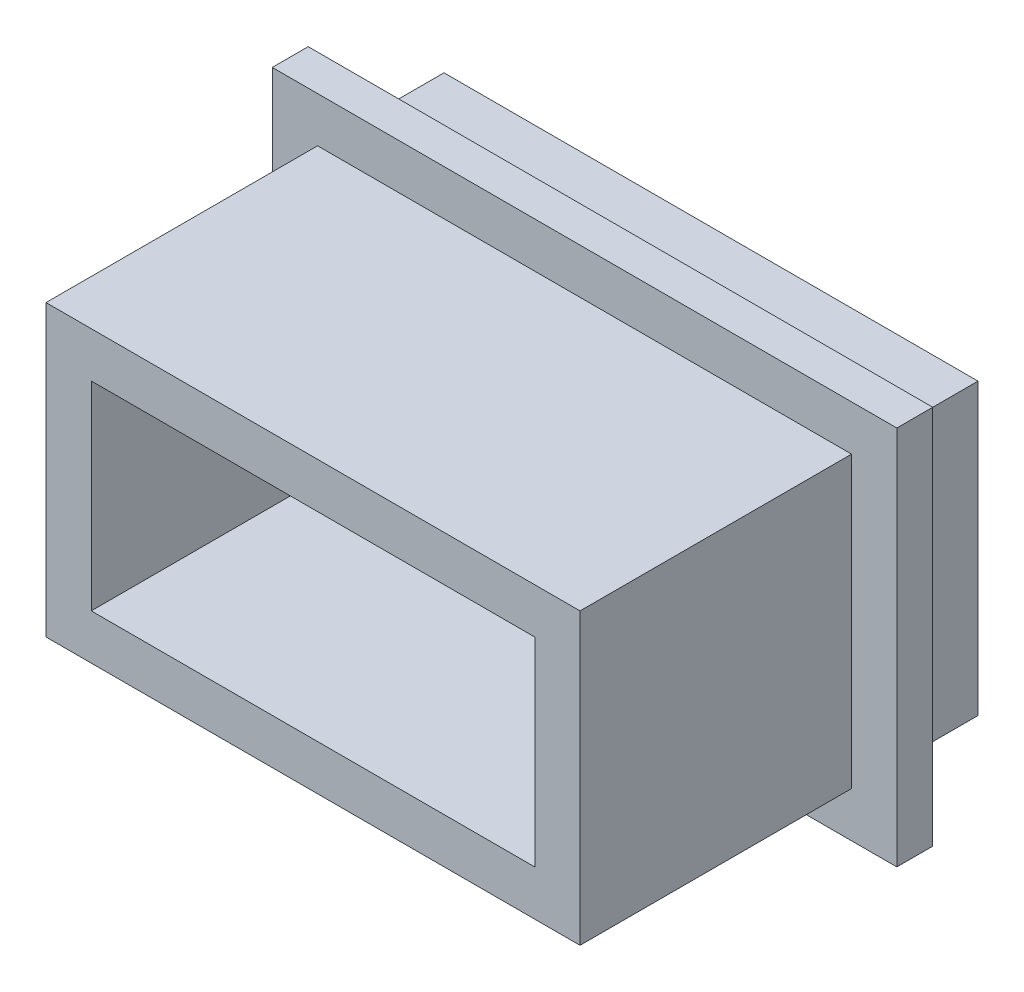
ISO-10303-21;
HEADER;
FILE_DESCRIPTION(('STEP AP214'),'2;1');
FILE_NAME('part.step','',(''),(''),'','','');
FILE_SCHEMA(('AUTOMOTIVE_DESIGN { 1 0 10303 214 1 1 1 1 }'));
ENDSEC;
DATA;
#1=APPLICATION_CONTEXT('core data for automotive mechanical design processes');
#2=APPLICATION_PROTOCOL_DEFINITION('international standard','automotive_design',2000,#1);
#3=PRODUCT_CONTEXT('',#1,'mechanical');
#4=PRODUCT('Part','Part','',(#3));
#5=PRODUCT_RELATED_PRODUCT_CATEGORY('part','',(#4));
#6=PRODUCT_DEFINITION_FORMATION('','',#4);
#7=PRODUCT_DEFINITION_CONTEXT('part definition',#1,'design');
#8=PRODUCT_DEFINITION('design','',#6,#7);
#9=PRODUCT_DEFINITION_SHAPE('','',#8);
#10=(LENGTH_UNIT() NAMED_UNIT(*) SI_UNIT(.MILLI.,.METRE.));
#11=(NAMED_UNIT(*) PLANE_ANGLE_UNIT() SI_UNIT($,.RADIAN.));
#12=(NAMED_UNIT(*) SI_UNIT($,.STERADIAN.) SOLID_ANGLE_UNIT());
#13=UNCERTAINTY_MEASURE_WITH_UNIT(LENGTH_MEASURE(1.E-05),#10,'distance_accuracy_value','');
#14=(GEOMETRIC_REPRESENTATION_CONTEXT(3) GLOBAL_UNCERTAINTY_ASSIGNED_CONTEXT((#13)) GLOBAL_UNIT_ASSIGNED_CONTEXT((#10,
#11,#12)) REPRESENTATION_CONTEXT('',''));
#15=CARTESIAN_POINT('',(0.,0.,0.));
#16=DIRECTION('',(0.,0.,1.));
#17=DIRECTION('',(1.,0.,0.));
#18=AXIS2_PLACEMENT_3D('',#15,#16,#17);
#19=CARTESIAN_POINT('',(0.,0.,1.396875));
#20=DIRECTION('',(0.,0.,1.));
#21=DIRECTION('',(1.,0.,0.));
#22=AXIS2_PLACEMENT_3D('',#19,#20,#21);
#23=PLANE('',#22);
#24=DIRECTION('',(1.,0.,0.));
#25=VECTOR('',#24,1.);
#26=CARTESIAN_POINT('',(-3.45,3.3,1.396875));
#27=LINE('',#26,#25);
#28=CARTESIAN_POINT('',(-3.45,3.3,1.396875));
#29=VERTEX_POINT('',#28);
#30=CARTESIAN_POINT('',(3.45,3.3,1.396875));
#31=VERTEX_POINT('',#30);
#32=EDGE_CURVE('E246',#29,#31,#27,.T.);
#33=ORIENTED_EDGE('',*,*,#32,.T.);
#34=DIRECTION('',(0.,1.,0.));
#35=VECTOR('',#34,1.);
#36=CARTESIAN_POINT('',(3.45,3.3,1.396875));
#37=LINE('',#36,#35);
#38=CARTESIAN_POINT('',(3.45,7.5,1.396875));
#39=VERTEX_POINT('',#38);
#40=EDGE_CURVE('E265',#31,#39,#37,.T.);
#41=ORIENTED_EDGE('',*,*,#40,.T.);
#42=DIRECTION('',(-1.,0.,0.));
#43=VECTOR('',#42,1.);
#44=CARTESIAN_POINT('',(3.45,7.5,1.396875));
#45=LINE('',#44,#43);
#46=CARTESIAN_POINT('',(-3.45,7.5,1.396875));
#47=VERTEX_POINT('',#46);
#48=EDGE_CURVE('E257',#39,#47,#45,.T.);
#49=ORIENTED_EDGE('',*,*,#48,.T.);
#50=DIRECTION('',(0.,-1.,0.));
#51=VECTOR('',#50,1.);
#52=CARTESIAN_POINT('',(-3.45,7.5,1.396875));
#53=LINE('',#52,#51);
#54=EDGE_CURVE('E249',#47,#29,#53,.T.);
#55=ORIENTED_EDGE('',*,*,#54,.T.);
#56=EDGE_LOOP('',(#33,#41,#49,#55));
#57=FACE_BOUND('',#56,.T.);
#58=DIRECTION('',(0.,1.,0.));
#59=VECTOR('',#58,1.);
#60=CARTESIAN_POINT('',(2.95,3.8,1.396875));
#61=LINE('',#60,#59);
#62=CARTESIAN_POINT('',(2.95,3.8,1.396875));
#63=VERTEX_POINT('',#62);
#64=CARTESIAN_POINT('',(2.95,7.,1.396875));
#65=VERTEX_POINT('',#64);
#66=EDGE_CURVE('E278',#63,#65,#61,.T.);
#67=ORIENTED_EDGE('',*,*,#66,.F.);
#68=DIRECTION('',(1.,0.,0.));
#69=VECTOR('',#68,1.);
#70=CARTESIAN_POINT('',(-2.95,3.8,1.396875));
#71=LINE('',#70,#69);
#72=CARTESIAN_POINT('',(-2.95,3.8,1.396875));
#73=VERTEX_POINT('',#72);
#74=EDGE_CURVE('E285',#73,#63,#71,.T.);
#75=ORIENTED_EDGE('',*,*,#74,.F.);
#76=DIRECTION('',(0.,-1.,0.));
#77=VECTOR('',#76,1.);
#78=CARTESIAN_POINT('',(-2.95,7.,1.396875));
#79=LINE('',#78,#77);
#80=CARTESIAN_POINT('',(-2.95,7.,1.396875));
#81=VERTEX_POINT('',#80);
#82=EDGE_CURVE('E274',#81,#73,#79,.T.);
#83=ORIENTED_EDGE('',*,*,#82,.F.);
#84=DIRECTION('',(-1.,0.,0.));
#85=VECTOR('',#84,1.);
#86=CARTESIAN_POINT('',(2.95,7.,1.396875));
#87=LINE('',#86,#85);
#88=EDGE_CURVE('E279',#65,#81,#87,.T.);
#89=ORIENTED_EDGE('',*,*,#88,.F.);
#90=EDGE_LOOP('',(#67,#75,#83,#89));
#91=FACE_BOUND('',#90,.T.);
#92=ADVANCED_FACE('F39',(#57,#91),#23,.T.);
#93=CARTESIAN_POINT('',(0.,0.,0.));
#94=DIRECTION('',(0.,0.,1.));
#95=DIRECTION('',(1.,0.,0.));
#96=AXIS2_PLACEMENT_3D('',#93,#94,#95);
#97=PLANE('',#96);
#98=DIRECTION('',(1.,0.,0.));
#99=VECTOR('',#98,1.);
#100=CARTESIAN_POINT('',(-2.95,3.8,0.));
#101=LINE('',#100,#99);
#102=CARTESIAN_POINT('',(-2.95,3.8,0.));
#103=VERTEX_POINT('',#102);
#104=CARTESIAN_POINT('',(2.95,3.8,0.));
#105=VERTEX_POINT('',#104);
#106=EDGE_CURVE('E140',#103,#105,#101,.T.);
#107=ORIENTED_EDGE('',*,*,#106,.F.);
#108=DIRECTION('',(0.,-1.,0.));
#109=VECTOR('',#108,1.);
#110=CARTESIAN_POINT('',(-2.95,7.,0.));
#111=LINE('',#110,#109);
#112=CARTESIAN_POINT('',(-2.95,7.,0.));
#113=VERTEX_POINT('',#112);
#114=EDGE_CURVE('E110',#113,#103,#111,.T.);
#115=ORIENTED_EDGE('',*,*,#114,.F.);
#116=DIRECTION('',(-1.,0.,0.));
#117=VECTOR('',#116,1.);
#118=CARTESIAN_POINT('',(2.95,7.,0.));
#119=LINE('',#118,#117);
#120=CARTESIAN_POINT('',(2.95,7.,0.));
#121=VERTEX_POINT('',#120);
#122=EDGE_CURVE('E131',#121,#113,#119,.T.);
#123=ORIENTED_EDGE('',*,*,#122,.F.);
#124=DIRECTION('',(0.,1.,0.));
#125=VECTOR('',#124,1.);
#126=CARTESIAN_POINT('',(2.95,3.8,0.));
#127=LINE('',#126,#125);
#128=EDGE_CURVE('E128',#105,#121,#127,.T.);
#129=ORIENTED_EDGE('',*,*,#128,.F.);
#130=EDGE_LOOP('',(#107,#115,#123,#129));
#131=FACE_BOUND('',#130,.T.);
#132=DIRECTION('',(1.,0.,0.));
#133=VECTOR('',#132,1.);
#134=CARTESIAN_POINT('',(-2.45,4.3,0.));
#135=LINE('',#134,#133);
#136=CARTESIAN_POINT('',(-2.45,4.3,0.));
#137=VERTEX_POINT('',#136);
#138=CARTESIAN_POINT('',(2.45,4.3,0.));
#139=VERTEX_POINT('',#138);
#140=EDGE_CURVE('E98',#137,#139,#135,.T.);
#141=ORIENTED_EDGE('',*,*,#140,.T.);
#142=DIRECTION('',(0.,1.,0.));
#143=VECTOR('',#142,1.);
#144=CARTESIAN_POINT('',(2.45,4.3,0.));
#145=LINE('',#144,#143);
#146=CARTESIAN_POINT('',(2.45,6.5,0.));
#147=VERTEX_POINT('',#146);
#148=EDGE_CURVE('E109',#139,#147,#145,.T.);
#149=ORIENTED_EDGE('',*,*,#148,.T.);
#150=DIRECTION('',(-1.,0.,0.));
#151=VECTOR('',#150,1.);
#152=CARTESIAN_POINT('',(2.45,6.5,0.));
#153=LINE('',#152,#151);
#154=CARTESIAN_POINT('',(-2.45,6.5,0.));
#155=VERTEX_POINT('',#154);
#156=EDGE_CURVE('E117',#147,#155,#153,.T.);
#157=ORIENTED_EDGE('',*,*,#156,.T.);
#158=DIRECTION('',(0.,-1.,0.));
#159=VECTOR('',#158,1.);
#160=CARTESIAN_POINT('',(-2.45,6.5,0.));
#161=LINE('',#160,#159);
#162=EDGE_CURVE('E118',#155,#137,#161,.T.);
#163=ORIENTED_EDGE('',*,*,#162,.T.);
#164=EDGE_LOOP('',(#141,#149,#157,#163));
#165=FACE_BOUND('',#164,.T.);
#166=ADVANCED_FACE('F119',(#131,#165),#97,.F.);
#167=CARTESIAN_POINT('',(-2.95,3.8,7.71192967781993));
#168=DIRECTION('',(0.,1.,0.));
#169=DIRECTION('',(0.,0.,1.));
#170=AXIS2_PLACEMENT_3D('',#167,#168,#169);
#171=PLANE('',#170);
#172=DIRECTION('',(0.,0.,-1.));
#173=VECTOR('',#172,1.);
#174=CARTESIAN_POINT('',(2.95,3.8,7.71192967781993));
#175=LINE('',#174,#173);
#176=CARTESIAN_POINT('',(2.95,3.8,1.));
#177=VERTEX_POINT('',#176);
#178=EDGE_CURVE('E126',#177,#105,#175,.T.);
#179=ORIENTED_EDGE('',*,*,#178,.F.);
#180=DIRECTION('',(-1.,0.,0.));
#181=VECTOR('',#180,1.);
#182=CARTESIAN_POINT('',(-2.95,3.8,1.));
#183=LINE('',#182,#181);
#184=CARTESIAN_POINT('',(-2.95,3.8,1.));
#185=VERTEX_POINT('',#184);
#186=EDGE_CURVE('E136',#177,#185,#183,.T.);
#187=ORIENTED_EDGE('',*,*,#186,.T.);
#188=DIRECTION('',(0.,0.,-1.));
#189=VECTOR('',#188,1.);
#190=CARTESIAN_POINT('',(-2.95,3.8,7.71192967781993));
#191=LINE('',#190,#189);
#192=EDGE_CURVE('E137',#185,#103,#191,.T.);
#193=ORIENTED_EDGE('',*,*,#192,.T.);
#194=ORIENTED_EDGE('',*,*,#106,.T.);
#195=EDGE_LOOP('',(#179,#187,#193,#194));
#196=FACE_BOUND('',#195,.T.);
#197=ADVANCED_FACE('F325',(#196),#171,.F.);
#198=CARTESIAN_POINT('',(2.95,3.8,7.71192967781993));
#199=DIRECTION('',(-1.,0.,0.));
#200=DIRECTION('',(0.,-1.,0.));
#201=AXIS2_PLACEMENT_3D('',#198,#199,#200);
#202=PLANE('',#201);
#203=DIRECTION('',(0.,0.,-1.));
#204=VECTOR('',#203,1.);
#205=CARTESIAN_POINT('',(2.95,7.,7.71192967781993));
#206=LINE('',#205,#204);
#207=CARTESIAN_POINT('',(2.95,7.,1.));
#208=VERTEX_POINT('',#207);
#209=EDGE_CURVE('E135',#208,#121,#206,.T.);
#210=ORIENTED_EDGE('',*,*,#209,.F.);
#211=DIRECTION('',(0.,-1.,0.));
#212=VECTOR('',#211,1.);
#213=CARTESIAN_POINT('',(2.95,3.8,1.));
#214=LINE('',#213,#212);
#215=EDGE_CURVE('E132',#208,#177,#214,.T.);
#216=ORIENTED_EDGE('',*,*,#215,.T.);
#217=ORIENTED_EDGE('',*,*,#178,.T.);
#218=ORIENTED_EDGE('',*,*,#128,.T.);
#219=EDGE_LOOP('',(#210,#216,#217,#218));
#220=FACE_BOUND('',#219,.T.);
#221=ADVANCED_FACE('F226',(#220),#202,.F.);
#222=CARTESIAN_POINT('',(2.95,7.,7.71192967781993));
#223=DIRECTION('',(0.,-1.,0.));
#224=DIRECTION('',(0.,0.,-1.));
#225=AXIS2_PLACEMENT_3D('',#222,#223,#224);
#226=PLANE('',#225);
#227=DIRECTION('',(0.,0.,-1.));
#228=VECTOR('',#227,1.);
#229=CARTESIAN_POINT('',(-2.95,7.,7.71192967781993));
#230=LINE('',#229,#228);
#231=CARTESIAN_POINT('',(-2.95,7.,1.));
#232=VERTEX_POINT('',#231);
#233=EDGE_CURVE('E138',#232,#113,#230,.T.);
#234=ORIENTED_EDGE('',*,*,#233,.F.);
#235=DIRECTION('',(1.,0.,0.));
#236=VECTOR('',#235,1.);
#237=CARTESIAN_POINT('',(2.95,7.,1.));
#238=LINE('',#237,#236);
#239=EDGE_CURVE('E133',#232,#208,#238,.T.);
#240=ORIENTED_EDGE('',*,*,#239,.T.);
#241=ORIENTED_EDGE('',*,*,#209,.T.);
#242=ORIENTED_EDGE('',*,*,#122,.T.);
#243=EDGE_LOOP('',(#234,#240,#241,#242));
#244=FACE_BOUND('',#243,.T.);
#245=ADVANCED_FACE('F233',(#244),#226,.F.);
#246=CARTESIAN_POINT('',(-2.95,7.,7.71192967781993));
#247=DIRECTION('',(1.,0.,0.));
#248=DIRECTION('',(0.,1.,0.));
#249=AXIS2_PLACEMENT_3D('',#246,#247,#248);
#250=PLANE('',#249);
#251=ORIENTED_EDGE('',*,*,#192,.F.);
#252=DIRECTION('',(0.,1.,0.));
#253=VECTOR('',#252,1.);
#254=CARTESIAN_POINT('',(-2.95,7.,1.));
#255=LINE('',#254,#253);
#256=EDGE_CURVE('E43',#185,#232,#255,.T.);
#257=ORIENTED_EDGE('',*,*,#256,.T.);
#258=ORIENTED_EDGE('',*,*,#233,.T.);
#259=ORIENTED_EDGE('',*,*,#114,.T.);
#260=EDGE_LOOP('',(#251,#257,#258,#259));
#261=FACE_BOUND('',#260,.T.);
#262=ADVANCED_FACE('F338',(#261),#250,.F.);
#263=CARTESIAN_POINT('',(-2.45,4.3,7.71192967781993));
#264=DIRECTION('',(0.,1.,0.));
#265=DIRECTION('',(0.,0.,1.));
#266=AXIS2_PLACEMENT_3D('',#263,#264,#265);
#267=PLANE('',#266);
#268=DIRECTION('',(0.,0.,-1.));
#269=VECTOR('',#268,1.);
#270=CARTESIAN_POINT('',(-2.45,4.3,7.71192967781993));
#271=LINE('',#270,#269);
#272=CARTESIAN_POINT('',(-2.45,4.3,4.396875));
#273=VERTEX_POINT('',#272);
#274=EDGE_CURVE('E11',#273,#137,#271,.T.);
#275=ORIENTED_EDGE('',*,*,#274,.F.);
#276=DIRECTION('',(1.,0.,0.));
#277=VECTOR('',#276,1.);
#278=CARTESIAN_POINT('',(-2.45,4.3,4.396875));
#279=LINE('',#278,#277);
#280=CARTESIAN_POINT('',(2.45,4.3,4.396875));
#281=VERTEX_POINT('',#280);
#282=EDGE_CURVE('E105',#273,#281,#279,.T.);
#283=ORIENTED_EDGE('',*,*,#282,.T.);
#284=DIRECTION('',(0.,0.,-1.));
#285=VECTOR('',#284,1.);
#286=CARTESIAN_POINT('',(2.45,4.3,7.71192967781993));
#287=LINE('',#286,#285);
#288=EDGE_CURVE('E94',#281,#139,#287,.T.);
#289=ORIENTED_EDGE('',*,*,#288,.T.);
#290=ORIENTED_EDGE('',*,*,#140,.F.);
#291=EDGE_LOOP('',(#275,#283,#289,#290));
#292=FACE_BOUND('',#291,.T.);
#293=ADVANCED_FACE('F41',(#292),#267,.T.);
#294=CARTESIAN_POINT('',(2.45,4.3,7.71192967781993));
#295=DIRECTION('',(-1.,0.,0.));
#296=DIRECTION('',(0.,0.,1.));
#297=AXIS2_PLACEMENT_3D('',#294,#295,#296);
#298=PLANE('',#297);
#299=ORIENTED_EDGE('',*,*,#288,.F.);
#300=DIRECTION('',(0.,1.,0.));
#301=VECTOR('',#300,1.);
#302=CARTESIAN_POINT('',(2.45,4.3,4.396875));
#303=LINE('',#302,#301);
#304=CARTESIAN_POINT('',(2.45,6.5,4.396875));
#305=VERTEX_POINT('',#304);
#306=EDGE_CURVE('E291',#281,#305,#303,.T.);
#307=ORIENTED_EDGE('',*,*,#306,.T.);
#308=DIRECTION('',(0.,0.,-1.));
#309=VECTOR('',#308,1.);
#310=CARTESIAN_POINT('',(2.45,6.5,7.71192967781993));
#311=LINE('',#310,#309);
#312=EDGE_CURVE('E106',#305,#147,#311,.T.);
#313=ORIENTED_EDGE('',*,*,#312,.T.);
#314=ORIENTED_EDGE('',*,*,#148,.F.);
#315=EDGE_LOOP('',(#299,#307,#313,#314));
#316=FACE_BOUND('',#315,.T.);
#317=ADVANCED_FACE('F112',(#316),#298,.T.);
#318=CARTESIAN_POINT('',(2.45,6.5,7.71192967781993));
#319=DIRECTION('',(0.,-1.,0.));
#320=DIRECTION('',(0.,0.,-1.));
#321=AXIS2_PLACEMENT_3D('',#318,#319,#320);
#322=PLANE('',#321);
#323=ORIENTED_EDGE('',*,*,#312,.F.);
#324=DIRECTION('',(-1.,0.,0.));
#325=VECTOR('',#324,1.);
#326=CARTESIAN_POINT('',(2.45,6.5,4.396875));
#327=LINE('',#326,#325);
#328=CARTESIAN_POINT('',(-2.45,6.5,4.396875));
#329=VERTEX_POINT('',#328);
#330=EDGE_CURVE('E170',#305,#329,#327,.T.);
#331=ORIENTED_EDGE('',*,*,#330,.T.);
#332=DIRECTION('',(0.,0.,-1.));
#333=VECTOR('',#332,1.);
#334=CARTESIAN_POINT('',(-2.45,6.5,7.71192967781993));
#335=LINE('',#334,#333);
#336=EDGE_CURVE('E48',#329,#155,#335,.T.);
#337=ORIENTED_EDGE('',*,*,#336,.T.);
#338=ORIENTED_EDGE('',*,*,#156,.F.);
#339=EDGE_LOOP('',(#323,#331,#337,#338));
#340=FACE_BOUND('',#339,.T.);
#341=ADVANCED_FACE('F161',(#340),#322,.T.);
#342=CARTESIAN_POINT('',(-2.45,6.5,7.71192967781993));
#343=DIRECTION('',(1.,0.,0.));
#344=DIRECTION('',(0.,0.,-1.));
#345=AXIS2_PLACEMENT_3D('',#342,#343,#344);
#346=PLANE('',#345);
#347=ORIENTED_EDGE('',*,*,#336,.F.);
#348=DIRECTION('',(0.,-1.,0.));
#349=VECTOR('',#348,1.);
#350=CARTESIAN_POINT('',(-2.45,6.5,4.396875));
#351=LINE('',#350,#349);
#352=EDGE_CURVE('E174',#329,#273,#351,.T.);
#353=ORIENTED_EDGE('',*,*,#352,.T.);
#354=ORIENTED_EDGE('',*,*,#274,.T.);
#355=ORIENTED_EDGE('',*,*,#162,.F.);
#356=EDGE_LOOP('',(#347,#353,#354,#355));
#357=FACE_BOUND('',#356,.T.);
#358=ADVANCED_FACE('F172',(#357),#346,.T.);
#359=CARTESIAN_POINT('',(0.,0.,1.));
#360=DIRECTION('',(0.,0.,1.));
#361=DIRECTION('',(1.,0.,0.));
#362=AXIS2_PLACEMENT_3D('',#359,#360,#361);
#363=PLANE('',#362);
#364=ORIENTED_EDGE('',*,*,#215,.F.);
#365=ORIENTED_EDGE('',*,*,#239,.F.);
#366=ORIENTED_EDGE('',*,*,#256,.F.);
#367=ORIENTED_EDGE('',*,*,#186,.F.);
#368=EDGE_LOOP('',(#364,#365,#366,#367));
#369=FACE_BOUND('',#368,.T.);
#370=DIRECTION('',(1.,0.,0.));
#371=VECTOR('',#370,1.);
#372=CARTESIAN_POINT('',(-3.45,3.3,1.));
#373=LINE('',#372,#371);
#374=CARTESIAN_POINT('',(-3.45,3.3,1.));
#375=VERTEX_POINT('',#374);
#376=CARTESIAN_POINT('',(3.45,3.3,1.));
#377=VERTEX_POINT('',#376);
#378=EDGE_CURVE('E254',#375,#377,#373,.T.);
#379=ORIENTED_EDGE('',*,*,#378,.F.);
#380=DIRECTION('',(0.,-1.,0.));
#381=VECTOR('',#380,1.);
#382=CARTESIAN_POINT('',(-3.45,7.5,1.));
#383=LINE('',#382,#381);
#384=CARTESIAN_POINT('',(-3.45,7.5,1.));
#385=VERTEX_POINT('',#384);
#386=EDGE_CURVE('E247',#385,#375,#383,.T.);
#387=ORIENTED_EDGE('',*,*,#386,.F.);
#388=DIRECTION('',(-1.,0.,0.));
#389=VECTOR('',#388,1.);
#390=CARTESIAN_POINT('',(3.45,7.5,1.));
#391=LINE('',#390,#389);
#392=CARTESIAN_POINT('',(3.45,7.5,1.));
#393=VERTEX_POINT('',#392);
#394=EDGE_CURVE('E253',#393,#385,#391,.T.);
#395=ORIENTED_EDGE('',*,*,#394,.F.);
#396=DIRECTION('',(0.,1.,0.));
#397=VECTOR('',#396,1.);
#398=CARTESIAN_POINT('',(3.45,3.3,1.));
#399=LINE('',#398,#397);
#400=EDGE_CURVE('E251',#377,#393,#399,.T.);
#401=ORIENTED_EDGE('',*,*,#400,.F.);
#402=EDGE_LOOP('',(#379,#387,#395,#401));
#403=FACE_BOUND('',#402,.T.);
#404=ADVANCED_FACE('F227',(#369,#403),#363,.F.);
#405=CARTESIAN_POINT('',(-3.45,3.3,1.396875));
#406=DIRECTION('',(0.,1.,0.));
#407=DIRECTION('',(0.,0.,1.));
#408=AXIS2_PLACEMENT_3D('',#405,#406,#407);
#409=PLANE('',#408);
#410=ORIENTED_EDGE('',*,*,#378,.T.);
#411=DIRECTION('',(0.,0.,-1.));
#412=VECTOR('',#411,1.);
#413=CARTESIAN_POINT('',(3.45,3.3,1.396875));
#414=LINE('',#413,#412);
#415=EDGE_CURVE('E123',#31,#377,#414,.T.);
#416=ORIENTED_EDGE('',*,*,#415,.F.);
#417=ORIENTED_EDGE('',*,*,#32,.F.);
#418=DIRECTION('',(0.,0.,-1.));
#419=VECTOR('',#418,1.);
#420=CARTESIAN_POINT('',(-3.45,3.3,1.396875));
#421=LINE('',#420,#419);
#422=EDGE_CURVE('E241',#29,#375,#421,.T.);
#423=ORIENTED_EDGE('',*,*,#422,.T.);
#424=EDGE_LOOP('',(#410,#416,#417,#423));
#425=FACE_BOUND('',#424,.T.);
#426=ADVANCED_FACE('F327',(#425),#409,.F.);
#427=CARTESIAN_POINT('',(3.45,3.3,1.396875));
#428=DIRECTION('',(-1.,0.,0.));
#429=DIRECTION('',(0.,-1.,0.));
#430=AXIS2_PLACEMENT_3D('',#427,#428,#429);
#431=PLANE('',#430);
#432=ORIENTED_EDGE('',*,*,#400,.T.);
#433=DIRECTION('',(0.,0.,-1.));
#434=VECTOR('',#433,1.);
#435=CARTESIAN_POINT('',(3.45,7.5,1.396875));
#436=LINE('',#435,#434);
#437=EDGE_CURVE('E125',#39,#393,#436,.T.);
#438=ORIENTED_EDGE('',*,*,#437,.F.);
#439=ORIENTED_EDGE('',*,*,#40,.F.);
#440=ORIENTED_EDGE('',*,*,#415,.T.);
#441=EDGE_LOOP('',(#432,#438,#439,#440));
#442=FACE_BOUND('',#441,.T.);
#443=ADVANCED_FACE('F335',(#442),#431,.F.);
#444=CARTESIAN_POINT('',(3.45,7.5,1.396875));
#445=DIRECTION('',(0.,-1.,0.));
#446=DIRECTION('',(0.,0.,-1.));
#447=AXIS2_PLACEMENT_3D('',#444,#445,#446);
#448=PLANE('',#447);
#449=ORIENTED_EDGE('',*,*,#394,.T.);
#450=DIRECTION('',(0.,0.,-1.));
#451=VECTOR('',#450,1.);
#452=CARTESIAN_POINT('',(-3.45,7.5,1.396875));
#453=LINE('',#452,#451);
#454=EDGE_CURVE('E242',#47,#385,#453,.T.);
#455=ORIENTED_EDGE('',*,*,#454,.F.);
#456=ORIENTED_EDGE('',*,*,#48,.F.);
#457=ORIENTED_EDGE('',*,*,#437,.T.);
#458=EDGE_LOOP('',(#449,#455,#456,#457));
#459=FACE_BOUND('',#458,.T.);
#460=ADVANCED_FACE('F313',(#459),#448,.F.);
#461=CARTESIAN_POINT('',(-3.45,7.5,1.396875));
#462=DIRECTION('',(1.,0.,0.));
#463=DIRECTION('',(0.,1.,0.));
#464=AXIS2_PLACEMENT_3D('',#461,#462,#463);
#465=PLANE('',#464);
#466=ORIENTED_EDGE('',*,*,#386,.T.);
#467=ORIENTED_EDGE('',*,*,#422,.F.);
#468=ORIENTED_EDGE('',*,*,#54,.F.);
#469=ORIENTED_EDGE('',*,*,#454,.T.);
#470=EDGE_LOOP('',(#466,#467,#468,#469));
#471=FACE_BOUND('',#470,.T.);
#472=ADVANCED_FACE('F298',(#471),#465,.F.);
#473=CARTESIAN_POINT('',(0.,0.,4.396875));
#474=DIRECTION('',(0.,0.,1.));
#475=DIRECTION('',(1.,0.,0.));
#476=AXIS2_PLACEMENT_3D('',#473,#474,#475);
#477=PLANE('',#476);
#478=DIRECTION('',(1.,0.,0.));
#479=VECTOR('',#478,1.);
#480=CARTESIAN_POINT('',(-2.95,3.8,4.396875));
#481=LINE('',#480,#479);
#482=CARTESIAN_POINT('',(-2.95,3.8,4.396875));
#483=VERTEX_POINT('',#482);
#484=CARTESIAN_POINT('',(2.95,3.8,4.396875));
#485=VERTEX_POINT('',#484);
#486=EDGE_CURVE('E280',#483,#485,#481,.T.);
#487=ORIENTED_EDGE('',*,*,#486,.T.);
#488=DIRECTION('',(0.,1.,0.));
#489=VECTOR('',#488,1.);
#490=CARTESIAN_POINT('',(2.95,3.8,4.396875));
#491=LINE('',#490,#489);
#492=CARTESIAN_POINT('',(2.95,7.,4.396875));
#493=VERTEX_POINT('',#492);
#494=EDGE_CURVE('E287',#485,#493,#491,.T.);
#495=ORIENTED_EDGE('',*,*,#494,.T.);
#496=DIRECTION('',(-1.,0.,0.));
#497=VECTOR('',#496,1.);
#498=CARTESIAN_POINT('',(2.95,7.,4.396875));
#499=LINE('',#498,#497);
#500=CARTESIAN_POINT('',(-2.95,7.,4.396875));
#501=VERTEX_POINT('',#500);
#502=EDGE_CURVE('E288',#493,#501,#499,.T.);
#503=ORIENTED_EDGE('',*,*,#502,.T.);
#504=DIRECTION('',(0.,-1.,0.));
#505=VECTOR('',#504,1.);
#506=CARTESIAN_POINT('',(-2.95,7.,4.396875));
#507=LINE('',#506,#505);
#508=EDGE_CURVE('E273',#501,#483,#507,.T.);
#509=ORIENTED_EDGE('',*,*,#508,.T.);
#510=EDGE_LOOP('',(#487,#495,#503,#509));
#511=FACE_BOUND('',#510,.T.);
#512=ORIENTED_EDGE('',*,*,#282,.F.);
#513=ORIENTED_EDGE('',*,*,#352,.F.);
#514=ORIENTED_EDGE('',*,*,#330,.F.);
#515=ORIENTED_EDGE('',*,*,#306,.F.);
#516=EDGE_LOOP('',(#512,#513,#514,#515));
#517=FACE_BOUND('',#516,.T.);
#518=ADVANCED_FACE('F300',(#511,#517),#477,.T.);
#519=CARTESIAN_POINT('',(-2.95,3.8,4.396875));
#520=DIRECTION('',(0.,1.,0.));
#521=DIRECTION('',(0.,0.,1.));
#522=AXIS2_PLACEMENT_3D('',#519,#520,#521);
#523=PLANE('',#522);
#524=ORIENTED_EDGE('',*,*,#74,.T.);
#525=DIRECTION('',(0.,0.,-1.));
#526=VECTOR('',#525,1.);
#527=CARTESIAN_POINT('',(2.95,3.8,4.396875));
#528=LINE('',#527,#526);
#529=EDGE_CURVE('E256',#485,#63,#528,.T.);
#530=ORIENTED_EDGE('',*,*,#529,.F.);
#531=ORIENTED_EDGE('',*,*,#486,.F.);
#532=DIRECTION('',(0.,0.,-1.));
#533=VECTOR('',#532,1.);
#534=CARTESIAN_POINT('',(-2.95,3.8,4.396875));
#535=LINE('',#534,#533);
#536=EDGE_CURVE('E271',#483,#73,#535,.T.);
#537=ORIENTED_EDGE('',*,*,#536,.T.);
#538=EDGE_LOOP('',(#524,#530,#531,#537));
#539=FACE_BOUND('',#538,.T.);
#540=ADVANCED_FACE('F296',(#539),#523,.F.);
#541=CARTESIAN_POINT('',(2.95,3.8,4.396875));
#542=DIRECTION('',(-1.,0.,0.));
#543=DIRECTION('',(0.,-1.,0.));
#544=AXIS2_PLACEMENT_3D('',#541,#542,#543);
#545=PLANE('',#544);
#546=ORIENTED_EDGE('',*,*,#66,.T.);
#547=DIRECTION('',(0.,0.,-1.));
#548=VECTOR('',#547,1.);
#549=CARTESIAN_POINT('',(2.95,7.,4.396875));
#550=LINE('',#549,#548);
#551=EDGE_CURVE('E270',#493,#65,#550,.T.);
#552=ORIENTED_EDGE('',*,*,#551,.F.);
#553=ORIENTED_EDGE('',*,*,#494,.F.);
#554=ORIENTED_EDGE('',*,*,#529,.T.);
#555=EDGE_LOOP('',(#546,#552,#553,#554));
#556=FACE_BOUND('',#555,.T.);
#557=ADVANCED_FACE('F307',(#556),#545,.F.);
#558=CARTESIAN_POINT('',(2.95,7.,4.396875));
#559=DIRECTION('',(0.,-1.,0.));
#560=DIRECTION('',(0.,0.,-1.));
#561=AXIS2_PLACEMENT_3D('',#558,#559,#560);
#562=PLANE('',#561);
#563=ORIENTED_EDGE('',*,*,#88,.T.);
#564=DIRECTION('',(0.,0.,-1.));
#565=VECTOR('',#564,1.);
#566=CARTESIAN_POINT('',(-2.95,7.,4.396875));
#567=LINE('',#566,#565);
#568=EDGE_CURVE('E57',#501,#81,#567,.T.);
#569=ORIENTED_EDGE('',*,*,#568,.F.);
#570=ORIENTED_EDGE('',*,*,#502,.F.);
#571=ORIENTED_EDGE('',*,*,#551,.T.);
#572=EDGE_LOOP('',(#563,#569,#570,#571));
#573=FACE_BOUND('',#572,.T.);
#574=ADVANCED_FACE('F407',(#573),#562,.F.);
#575=CARTESIAN_POINT('',(-2.95,7.,4.396875));
#576=DIRECTION('',(1.,0.,0.));
#577=DIRECTION('',(0.,1.,0.));
#578=AXIS2_PLACEMENT_3D('',#575,#576,#577);
#579=PLANE('',#578);
#580=ORIENTED_EDGE('',*,*,#82,.T.);
#581=ORIENTED_EDGE('',*,*,#536,.F.);
#582=ORIENTED_EDGE('',*,*,#508,.F.);
#583=ORIENTED_EDGE('',*,*,#568,.T.);
#584=EDGE_LOOP('',(#580,#581,#582,#583));
#585=FACE_BOUND('',#584,.T.);
#586=ADVANCED_FACE('F411',(#585),#579,.F.);
#587=CLOSED_SHELL('',(#92,#166,#197,#221,#245,#262,#293,#317,#341,#358,#404,#426,#443,#460,#472,
#518,#540,#557,#574,#586));
#588=MANIFOLD_SOLID_BREP('B2',#587);
#589=ADVANCED_BREP_SHAPE_REPRESENTATION('',(#18,#588),#14);
#590=SHAPE_DEFINITION_REPRESENTATION(#9,#589);
ENDSEC;
END-ISO-10303-21;
